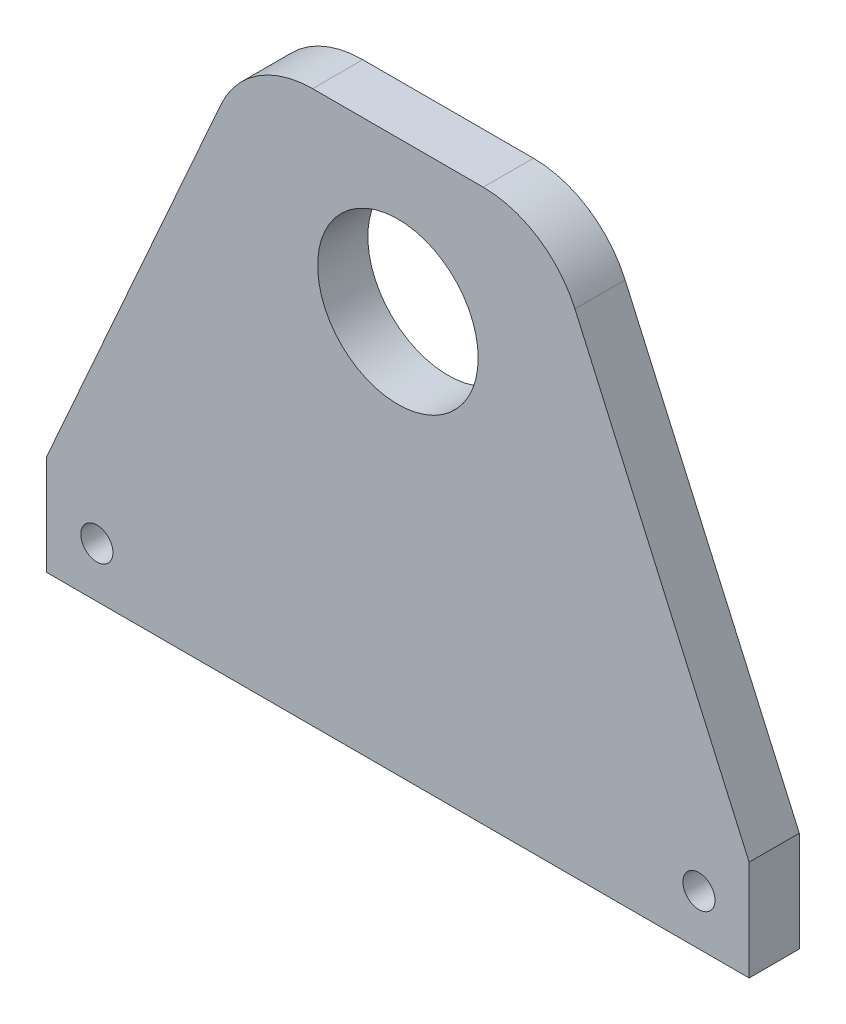
ISO-10303-21;
HEADER;
FILE_DESCRIPTION(('STEP AP214'),'2;1');
FILE_NAME('part.step','',(''),(''),'','','');
FILE_SCHEMA(('AUTOMOTIVE_DESIGN { 1 0 10303 214 1 1 1 1 }'));
ENDSEC;
DATA;
#1=APPLICATION_CONTEXT('core data for automotive mechanical design processes');
#2=APPLICATION_PROTOCOL_DEFINITION('international standard','automotive_design',2000,#1);
#3=PRODUCT_CONTEXT('',#1,'mechanical');
#4=PRODUCT('Part','Part','',(#3));
#5=PRODUCT_RELATED_PRODUCT_CATEGORY('part','',(#4));
#6=PRODUCT_DEFINITION_FORMATION('','',#4);
#7=PRODUCT_DEFINITION_CONTEXT('part definition',#1,'design');
#8=PRODUCT_DEFINITION('design','',#6,#7);
#9=PRODUCT_DEFINITION_SHAPE('','',#8);
#10=(LENGTH_UNIT() NAMED_UNIT(*) SI_UNIT(.MILLI.,.METRE.));
#11=(NAMED_UNIT(*) PLANE_ANGLE_UNIT() SI_UNIT($,.RADIAN.));
#12=(NAMED_UNIT(*) SI_UNIT($,.STERADIAN.) SOLID_ANGLE_UNIT());
#13=UNCERTAINTY_MEASURE_WITH_UNIT(LENGTH_MEASURE(1.E-05),#10,'distance_accuracy_value','');
#14=(GEOMETRIC_REPRESENTATION_CONTEXT(3) GLOBAL_UNCERTAINTY_ASSIGNED_CONTEXT((#13)) GLOBAL_UNIT_ASSIGNED_CONTEXT((#10,
#11,#12)) REPRESENTATION_CONTEXT('',''));
#15=CARTESIAN_POINT('',(0.,0.,0.));
#16=DIRECTION('',(0.,0.,1.));
#17=DIRECTION('',(1.,0.,0.));
#18=AXIS2_PLACEMENT_3D('',#15,#16,#17);
#19=CARTESIAN_POINT('',(0.,0.,5.));
#20=DIRECTION('',(0.,0.,-1.));
#21=DIRECTION('',(-1.,0.,0.));
#22=AXIS2_PLACEMENT_3D('',#19,#20,#21);
#23=PLANE('',#22);
#24=DIRECTION('',(-1.,0.,0.));
#25=VECTOR('',#24,1.);
#26=CARTESIAN_POINT('',(20.,55.,5.));
#27=LINE('',#26,#25);
#28=CARTESIAN_POINT('',(43.5012691091154,55.,5.));
#29=VERTEX_POINT('',#28);
#30=CARTESIAN_POINT('',(26.4987308908845,55.,5.));
#31=VERTEX_POINT('',#30);
#32=EDGE_CURVE('E145',#29,#31,#27,.T.);
#33=ORIENTED_EDGE('',*,*,#32,.T.);
#34=CARTESIAN_POINT('',(26.4987308908846,45.,5.));
#35=DIRECTION('',(0.,0.,-1.));
#36=DIRECTION('',(-1.,0.,0.));
#37=AXIS2_PLACEMENT_3D('',#34,#35,#36);
#38=CIRCLE('',#37,10.);
#39=CARTESIAN_POINT('',(17.360615404682,49.0613846605345,5.));
#40=VERTEX_POINT('',#39);
#41=EDGE_CURVE('E41',#31,#40,#38,.F.);
#42=ORIENTED_EDGE('',*,*,#41,.T.);
#43=DIRECTION('',(-0.406138466053448,-0.913811548620257,0.));
#44=VECTOR('',#43,1.);
#45=CARTESIAN_POINT('',(0.,10.,5.));
#46=LINE('',#45,#44);
#47=CARTESIAN_POINT('',(0.,10.,5.));
#48=VERTEX_POINT('',#47);
#49=EDGE_CURVE('E143',#40,#48,#46,.T.);
#50=ORIENTED_EDGE('',*,*,#49,.T.);
#51=DIRECTION('',(0.,-1.,0.));
#52=VECTOR('',#51,1.);
#53=CARTESIAN_POINT('',(0.,0.,5.));
#54=LINE('',#53,#52);
#55=CARTESIAN_POINT('',(0.,0.,5.));
#56=VERTEX_POINT('',#55);
#57=EDGE_CURVE('E115',#48,#56,#54,.T.);
#58=ORIENTED_EDGE('',*,*,#57,.T.);
#59=DIRECTION('',(1.,0.,0.));
#60=VECTOR('',#59,1.);
#61=CARTESIAN_POINT('',(70.,0.,5.));
#62=LINE('',#61,#60);
#63=CARTESIAN_POINT('',(70.,0.,5.));
#64=VERTEX_POINT('',#63);
#65=EDGE_CURVE('E110',#56,#64,#62,.T.);
#66=ORIENTED_EDGE('',*,*,#65,.T.);
#67=DIRECTION('',(0.,1.,0.));
#68=VECTOR('',#67,1.);
#69=CARTESIAN_POINT('',(70.,10.,5.));
#70=LINE('',#69,#68);
#71=CARTESIAN_POINT('',(70.,10.,5.));
#72=VERTEX_POINT('',#71);
#73=EDGE_CURVE('E100',#64,#72,#70,.T.);
#74=ORIENTED_EDGE('',*,*,#73,.T.);
#75=DIRECTION('',(-0.406138466053448,0.913811548620257,0.));
#76=VECTOR('',#75,1.);
#77=CARTESIAN_POINT('',(50.,55.,5.));
#78=LINE('',#77,#76);
#79=CARTESIAN_POINT('',(52.639384595318,49.0613846605345,5.));
#80=VERTEX_POINT('',#79);
#81=EDGE_CURVE('E109',#72,#80,#78,.T.);
#82=ORIENTED_EDGE('',*,*,#81,.T.);
#83=CARTESIAN_POINT('',(43.5012691091154,45.,5.));
#84=DIRECTION('',(0.,0.,-1.));
#85=DIRECTION('',(-1.,0.,0.));
#86=AXIS2_PLACEMENT_3D('',#83,#84,#85);
#87=CIRCLE('',#86,10.);
#88=EDGE_CURVE('E140',#80,#29,#87,.F.);
#89=ORIENTED_EDGE('',*,*,#88,.T.);
#90=EDGE_LOOP('',(#33,#42,#50,#58,#66,#74,#82,#89));
#91=FACE_BOUND('',#90,.T.);
#92=CARTESIAN_POINT('',(35.,40.,5.));
#93=DIRECTION('',(0.,0.,1.));
#94=DIRECTION('',(1.,0.,0.));
#95=AXIS2_PLACEMENT_3D('',#92,#93,#94);
#96=CIRCLE('',#95,8.);
#97=CARTESIAN_POINT('',(43.,40.,5.));
#98=VERTEX_POINT('',#97);
#99=EDGE_CURVE('E175',#98,#98,#96,.T.);
#100=ORIENTED_EDGE('',*,*,#99,.F.);
#101=EDGE_LOOP('',(#100));
#102=FACE_BOUND('',#101,.T.);
#103=CARTESIAN_POINT('',(5.,4.99999999999999,5.));
#104=DIRECTION('',(0.,0.,1.));
#105=DIRECTION('',(1.,0.,0.));
#106=AXIS2_PLACEMENT_3D('',#103,#104,#105);
#107=CIRCLE('',#106,1.6);
#108=CARTESIAN_POINT('',(6.60000000000001,4.99999999999999,5.));
#109=VERTEX_POINT('',#108);
#110=EDGE_CURVE('E185',#109,#109,#107,.T.);
#111=ORIENTED_EDGE('',*,*,#110,.F.);
#112=EDGE_LOOP('',(#111));
#113=FACE_BOUND('',#112,.T.);
#114=CARTESIAN_POINT('',(65.,5.,5.));
#115=DIRECTION('',(0.,0.,1.));
#116=DIRECTION('',(1.,0.,0.));
#117=AXIS2_PLACEMENT_3D('',#114,#115,#116);
#118=CIRCLE('',#117,1.60000000000001);
#119=CARTESIAN_POINT('',(66.6,5.,5.));
#120=VERTEX_POINT('',#119);
#121=EDGE_CURVE('E190',#120,#120,#118,.T.);
#122=ORIENTED_EDGE('',*,*,#121,.F.);
#123=EDGE_LOOP('',(#122));
#124=FACE_BOUND('',#123,.T.);
#125=ADVANCED_FACE('F33',(#91,#102,#113,#124),#23,.F.);
#126=CARTESIAN_POINT('',(0.,0.,0.));
#127=DIRECTION('',(0.,0.,-1.));
#128=DIRECTION('',(-1.,0.,0.));
#129=AXIS2_PLACEMENT_3D('',#126,#127,#128);
#130=PLANE('',#129);
#131=CARTESIAN_POINT('',(5.,4.99999999999999,0.));
#132=DIRECTION('',(0.,0.,1.));
#133=DIRECTION('',(1.,0.,0.));
#134=AXIS2_PLACEMENT_3D('',#131,#132,#133);
#135=CIRCLE('',#134,1.6);
#136=CARTESIAN_POINT('',(6.60000000000001,4.99999999999999,0.));
#137=VERTEX_POINT('',#136);
#138=EDGE_CURVE('E187',#137,#137,#135,.T.);
#139=ORIENTED_EDGE('',*,*,#138,.T.);
#140=EDGE_LOOP('',(#139));
#141=FACE_BOUND('',#140,.T.);
#142=DIRECTION('',(-0.406138466053448,-0.913811548620257,0.));
#143=VECTOR('',#142,1.);
#144=CARTESIAN_POINT('',(0.,10.,0.));
#145=LINE('',#144,#143);
#146=CARTESIAN_POINT('',(17.360615404682,49.0613846605345,0.));
#147=VERTEX_POINT('',#146);
#148=CARTESIAN_POINT('',(0.,10.,0.));
#149=VERTEX_POINT('',#148);
#150=EDGE_CURVE('E160',#147,#149,#145,.T.);
#151=ORIENTED_EDGE('',*,*,#150,.F.);
#152=CARTESIAN_POINT('',(26.4987308908846,45.,0.));
#153=DIRECTION('',(0.,0.,-1.));
#154=DIRECTION('',(-1.,0.,0.));
#155=AXIS2_PLACEMENT_3D('',#152,#153,#154);
#156=CIRCLE('',#155,10.);
#157=CARTESIAN_POINT('',(26.4987308908845,55.,0.));
#158=VERTEX_POINT('',#157);
#159=EDGE_CURVE('E134',#147,#158,#156,.T.);
#160=ORIENTED_EDGE('',*,*,#159,.T.);
#161=DIRECTION('',(-1.,0.,0.));
#162=VECTOR('',#161,1.);
#163=CARTESIAN_POINT('',(20.,55.,0.));
#164=LINE('',#163,#162);
#165=CARTESIAN_POINT('',(43.5012691091154,55.,0.));
#166=VERTEX_POINT('',#165);
#167=EDGE_CURVE('E158',#166,#158,#164,.T.);
#168=ORIENTED_EDGE('',*,*,#167,.F.);
#169=CARTESIAN_POINT('',(43.5012691091154,45.,0.));
#170=DIRECTION('',(0.,0.,-1.));
#171=DIRECTION('',(-1.,0.,0.));
#172=AXIS2_PLACEMENT_3D('',#169,#170,#171);
#173=CIRCLE('',#172,10.);
#174=CARTESIAN_POINT('',(52.639384595318,49.0613846605345,0.));
#175=VERTEX_POINT('',#174);
#176=EDGE_CURVE('E127',#166,#175,#173,.T.);
#177=ORIENTED_EDGE('',*,*,#176,.T.);
#178=DIRECTION('',(-0.406138466053448,0.913811548620257,0.));
#179=VECTOR('',#178,1.);
#180=CARTESIAN_POINT('',(50.,55.,0.));
#181=LINE('',#180,#179);
#182=CARTESIAN_POINT('',(70.,10.,0.));
#183=VERTEX_POINT('',#182);
#184=EDGE_CURVE('E163',#183,#175,#181,.T.);
#185=ORIENTED_EDGE('',*,*,#184,.F.);
#186=DIRECTION('',(0.,1.,0.));
#187=VECTOR('',#186,1.);
#188=CARTESIAN_POINT('',(70.,10.,0.));
#189=LINE('',#188,#187);
#190=CARTESIAN_POINT('',(70.,0.,0.));
#191=VERTEX_POINT('',#190);
#192=EDGE_CURVE('E166',#191,#183,#189,.T.);
#193=ORIENTED_EDGE('',*,*,#192,.F.);
#194=DIRECTION('',(1.,0.,0.));
#195=VECTOR('',#194,1.);
#196=CARTESIAN_POINT('',(70.,0.,0.));
#197=LINE('',#196,#195);
#198=CARTESIAN_POINT('',(0.,0.,0.));
#199=VERTEX_POINT('',#198);
#200=EDGE_CURVE('E123',#199,#191,#197,.T.);
#201=ORIENTED_EDGE('',*,*,#200,.F.);
#202=DIRECTION('',(0.,-1.,0.));
#203=VECTOR('',#202,1.);
#204=CARTESIAN_POINT('',(0.,0.,0.));
#205=LINE('',#204,#203);
#206=EDGE_CURVE('E119',#149,#199,#205,.T.);
#207=ORIENTED_EDGE('',*,*,#206,.F.);
#208=EDGE_LOOP('',(#151,#160,#168,#177,#185,#193,#201,#207));
#209=FACE_BOUND('',#208,.T.);
#210=CARTESIAN_POINT('',(35.,40.,0.));
#211=DIRECTION('',(0.,0.,1.));
#212=DIRECTION('',(1.,0.,0.));
#213=AXIS2_PLACEMENT_3D('',#210,#211,#212);
#214=CIRCLE('',#213,8.);
#215=CARTESIAN_POINT('',(43.,40.,0.));
#216=VERTEX_POINT('',#215);
#217=EDGE_CURVE('E178',#216,#216,#214,.T.);
#218=ORIENTED_EDGE('',*,*,#217,.T.);
#219=EDGE_LOOP('',(#218));
#220=FACE_BOUND('',#219,.T.);
#221=CARTESIAN_POINT('',(65.,5.,0.));
#222=DIRECTION('',(0.,0.,1.));
#223=DIRECTION('',(1.,0.,0.));
#224=AXIS2_PLACEMENT_3D('',#221,#222,#223);
#225=CIRCLE('',#224,1.60000000000001);
#226=CARTESIAN_POINT('',(66.6,5.,0.));
#227=VERTEX_POINT('',#226);
#228=EDGE_CURVE('E193',#227,#227,#225,.T.);
#229=ORIENTED_EDGE('',*,*,#228,.T.);
#230=EDGE_LOOP('',(#229));
#231=FACE_BOUND('',#230,.T.);
#232=ADVANCED_FACE('F156',(#141,#209,#220,#231),#130,.T.);
#233=CARTESIAN_POINT('',(70.,0.,5.));
#234=DIRECTION('',(0.,1.,0.));
#235=DIRECTION('',(-1.,0.,0.));
#236=AXIS2_PLACEMENT_3D('',#233,#234,#235);
#237=PLANE('',#236);
#238=ORIENTED_EDGE('',*,*,#200,.T.);
#239=DIRECTION('',(0.,0.,-1.));
#240=VECTOR('',#239,1.);
#241=CARTESIAN_POINT('',(70.,0.,5.));
#242=LINE('',#241,#240);
#243=EDGE_CURVE('E104',#64,#191,#242,.T.);
#244=ORIENTED_EDGE('',*,*,#243,.F.);
#245=ORIENTED_EDGE('',*,*,#65,.F.);
#246=DIRECTION('',(0.,0.,-1.));
#247=VECTOR('',#246,1.);
#248=CARTESIAN_POINT('',(0.,0.,5.));
#249=LINE('',#248,#247);
#250=EDGE_CURVE('E171',#56,#199,#249,.T.);
#251=ORIENTED_EDGE('',*,*,#250,.T.);
#252=EDGE_LOOP('',(#238,#244,#245,#251));
#253=FACE_BOUND('',#252,.T.);
#254=ADVANCED_FACE('F121',(#253),#237,.F.);
#255=CARTESIAN_POINT('',(70.,10.,5.));
#256=DIRECTION('',(-1.,0.,0.));
#257=DIRECTION('',(0.,0.,1.));
#258=AXIS2_PLACEMENT_3D('',#255,#256,#257);
#259=PLANE('',#258);
#260=ORIENTED_EDGE('',*,*,#192,.T.);
#261=DIRECTION('',(0.,0.,-1.));
#262=VECTOR('',#261,1.);
#263=CARTESIAN_POINT('',(70.,10.,5.));
#264=LINE('',#263,#262);
#265=EDGE_CURVE('E107',#72,#183,#264,.T.);
#266=ORIENTED_EDGE('',*,*,#265,.F.);
#267=ORIENTED_EDGE('',*,*,#73,.F.);
#268=ORIENTED_EDGE('',*,*,#243,.T.);
#269=EDGE_LOOP('',(#260,#266,#267,#268));
#270=FACE_BOUND('',#269,.T.);
#271=ADVANCED_FACE('F102',(#270),#259,.F.);
#272=CARTESIAN_POINT('',(50.,55.,5.));
#273=DIRECTION('',(-0.913811548620257,-0.406138466053448,0.));
#274=DIRECTION('',(0.406138466053448,-0.913811548620257,0.));
#275=AXIS2_PLACEMENT_3D('',#272,#273,#274);
#276=PLANE('',#275);
#277=ORIENTED_EDGE('',*,*,#184,.T.);
#278=DIRECTION('',(0.,0.,-1.));
#279=VECTOR('',#278,1.);
#280=CARTESIAN_POINT('',(52.639384595318,49.0613846605345,5.));
#281=LINE('',#280,#279);
#282=EDGE_CURVE('E11',#175,#80,#281,.F.);
#283=ORIENTED_EDGE('',*,*,#282,.T.);
#284=ORIENTED_EDGE('',*,*,#81,.F.);
#285=ORIENTED_EDGE('',*,*,#265,.T.);
#286=EDGE_LOOP('',(#277,#283,#284,#285));
#287=FACE_BOUND('',#286,.T.);
#288=ADVANCED_FACE('F219',(#287),#276,.F.);
#289=CARTESIAN_POINT('',(20.,55.,5.));
#290=DIRECTION('',(0.,-1.,0.));
#291=DIRECTION('',(1.,0.,0.));
#292=AXIS2_PLACEMENT_3D('',#289,#290,#291);
#293=PLANE('',#292);
#294=ORIENTED_EDGE('',*,*,#167,.T.);
#295=DIRECTION('',(0.,0.,-1.));
#296=VECTOR('',#295,1.);
#297=CARTESIAN_POINT('',(26.4987308908845,55.,5.));
#298=LINE('',#297,#296);
#299=EDGE_CURVE('E54',#158,#31,#298,.F.);
#300=ORIENTED_EDGE('',*,*,#299,.T.);
#301=ORIENTED_EDGE('',*,*,#32,.F.);
#302=DIRECTION('',(0.,0.,-1.));
#303=VECTOR('',#302,1.);
#304=CARTESIAN_POINT('',(43.5012691091154,55.,5.));
#305=LINE('',#304,#303);
#306=EDGE_CURVE('E136',#29,#166,#305,.T.);
#307=ORIENTED_EDGE('',*,*,#306,.T.);
#308=EDGE_LOOP('',(#294,#300,#301,#307));
#309=FACE_BOUND('',#308,.T.);
#310=ADVANCED_FACE('F161',(#309),#293,.F.);
#311=CARTESIAN_POINT('',(0.,10.,5.));
#312=DIRECTION('',(0.913811548620257,-0.406138466053448,0.));
#313=DIRECTION('',(0.406138466053448,0.913811548620257,0.));
#314=AXIS2_PLACEMENT_3D('',#311,#312,#313);
#315=PLANE('',#314);
#316=ORIENTED_EDGE('',*,*,#49,.F.);
#317=DIRECTION('',(0.,0.,-1.));
#318=VECTOR('',#317,1.);
#319=CARTESIAN_POINT('',(17.360615404682,49.0613846605345,5.));
#320=LINE('',#319,#318);
#321=EDGE_CURVE('E124',#40,#147,#320,.T.);
#322=ORIENTED_EDGE('',*,*,#321,.T.);
#323=ORIENTED_EDGE('',*,*,#150,.T.);
#324=DIRECTION('',(0.,0.,-1.));
#325=VECTOR('',#324,1.);
#326=CARTESIAN_POINT('',(0.,10.,5.));
#327=LINE('',#326,#325);
#328=EDGE_CURVE('E129',#48,#149,#327,.T.);
#329=ORIENTED_EDGE('',*,*,#328,.F.);
#330=EDGE_LOOP('',(#316,#322,#323,#329));
#331=FACE_BOUND('',#330,.T.);
#332=ADVANCED_FACE('F149',(#331),#315,.F.);
#333=CARTESIAN_POINT('',(0.,0.,5.));
#334=DIRECTION('',(1.,0.,0.));
#335=DIRECTION('',(0.,0.,-1.));
#336=AXIS2_PLACEMENT_3D('',#333,#334,#335);
#337=PLANE('',#336);
#338=ORIENTED_EDGE('',*,*,#206,.T.);
#339=ORIENTED_EDGE('',*,*,#250,.F.);
#340=ORIENTED_EDGE('',*,*,#57,.F.);
#341=ORIENTED_EDGE('',*,*,#328,.T.);
#342=EDGE_LOOP('',(#338,#339,#340,#341));
#343=FACE_BOUND('',#342,.T.);
#344=ADVANCED_FACE('F173',(#343),#337,.F.);
#345=CARTESIAN_POINT('',(35.,40.,5.));
#346=DIRECTION('',(0.,0.,-1.));
#347=DIRECTION('',(-1.,0.,0.));
#348=AXIS2_PLACEMENT_3D('',#345,#346,#347);
#349=CYLINDRICAL_SURFACE('',#348,8.);
#350=ORIENTED_EDGE('',*,*,#99,.T.);
#351=EDGE_LOOP('',(#350));
#352=FACE_BOUND('',#351,.T.);
#353=ORIENTED_EDGE('',*,*,#217,.F.);
#354=EDGE_LOOP('',(#353));
#355=FACE_BOUND('',#354,.T.);
#356=ADVANCED_FACE('F210',(#352,#355),#349,.F.);
#357=CARTESIAN_POINT('',(5.,4.99999999999999,5.));
#358=DIRECTION('',(0.,0.,-1.));
#359=DIRECTION('',(-1.,0.,0.));
#360=AXIS2_PLACEMENT_3D('',#357,#358,#359);
#361=CYLINDRICAL_SURFACE('',#360,1.6);
#362=ORIENTED_EDGE('',*,*,#110,.T.);
#363=EDGE_LOOP('',(#362));
#364=FACE_BOUND('',#363,.T.);
#365=ORIENTED_EDGE('',*,*,#138,.F.);
#366=EDGE_LOOP('',(#365));
#367=FACE_BOUND('',#366,.T.);
#368=ADVANCED_FACE('F231',(#364,#367),#361,.F.);
#369=CARTESIAN_POINT('',(65.,5.,5.));
#370=DIRECTION('',(0.,0.,-1.));
#371=DIRECTION('',(-1.,0.,0.));
#372=AXIS2_PLACEMENT_3D('',#369,#370,#371);
#373=CYLINDRICAL_SURFACE('',#372,1.60000000000001);
#374=ORIENTED_EDGE('',*,*,#121,.T.);
#375=EDGE_LOOP('',(#374));
#376=FACE_BOUND('',#375,.T.);
#377=ORIENTED_EDGE('',*,*,#228,.F.);
#378=EDGE_LOOP('',(#377));
#379=FACE_BOUND('',#378,.T.);
#380=ADVANCED_FACE('F199',(#376,#379),#373,.F.);
#381=CARTESIAN_POINT('',(26.4987308908846,45.,5.));
#382=DIRECTION('',(0.,0.,-1.));
#383=DIRECTION('',(-1.,0.,0.));
#384=AXIS2_PLACEMENT_3D('',#381,#382,#383);
#385=CYLINDRICAL_SURFACE('',#384,10.);
#386=ORIENTED_EDGE('',*,*,#41,.F.);
#387=ORIENTED_EDGE('',*,*,#299,.F.);
#388=ORIENTED_EDGE('',*,*,#159,.F.);
#389=ORIENTED_EDGE('',*,*,#321,.F.);
#390=EDGE_LOOP('',(#386,#387,#388,#389));
#391=FACE_BOUND('',#390,.T.);
#392=ADVANCED_FACE('F153',(#391),#385,.T.);
#393=CARTESIAN_POINT('',(43.5012691091154,45.,5.));
#394=DIRECTION('',(0.,0.,-1.));
#395=DIRECTION('',(-1.,0.,0.));
#396=AXIS2_PLACEMENT_3D('',#393,#394,#395);
#397=CYLINDRICAL_SURFACE('',#396,10.);
#398=ORIENTED_EDGE('',*,*,#88,.F.);
#399=ORIENTED_EDGE('',*,*,#282,.F.);
#400=ORIENTED_EDGE('',*,*,#176,.F.);
#401=ORIENTED_EDGE('',*,*,#306,.F.);
#402=EDGE_LOOP('',(#398,#399,#400,#401));
#403=FACE_BOUND('',#402,.T.);
#404=ADVANCED_FACE('F35',(#403),#397,.T.);
#405=CLOSED_SHELL('',(#125,#232,#254,#271,#288,#310,#332,#344,#356,#368,#380,#392,#404));
#406=MANIFOLD_SOLID_BREP('B2',#405);
#407=ADVANCED_BREP_SHAPE_REPRESENTATION('',(#18,#406),#14);
#408=SHAPE_DEFINITION_REPRESENTATION(#9,#407);
ENDSEC;
END-ISO-10303-21;
